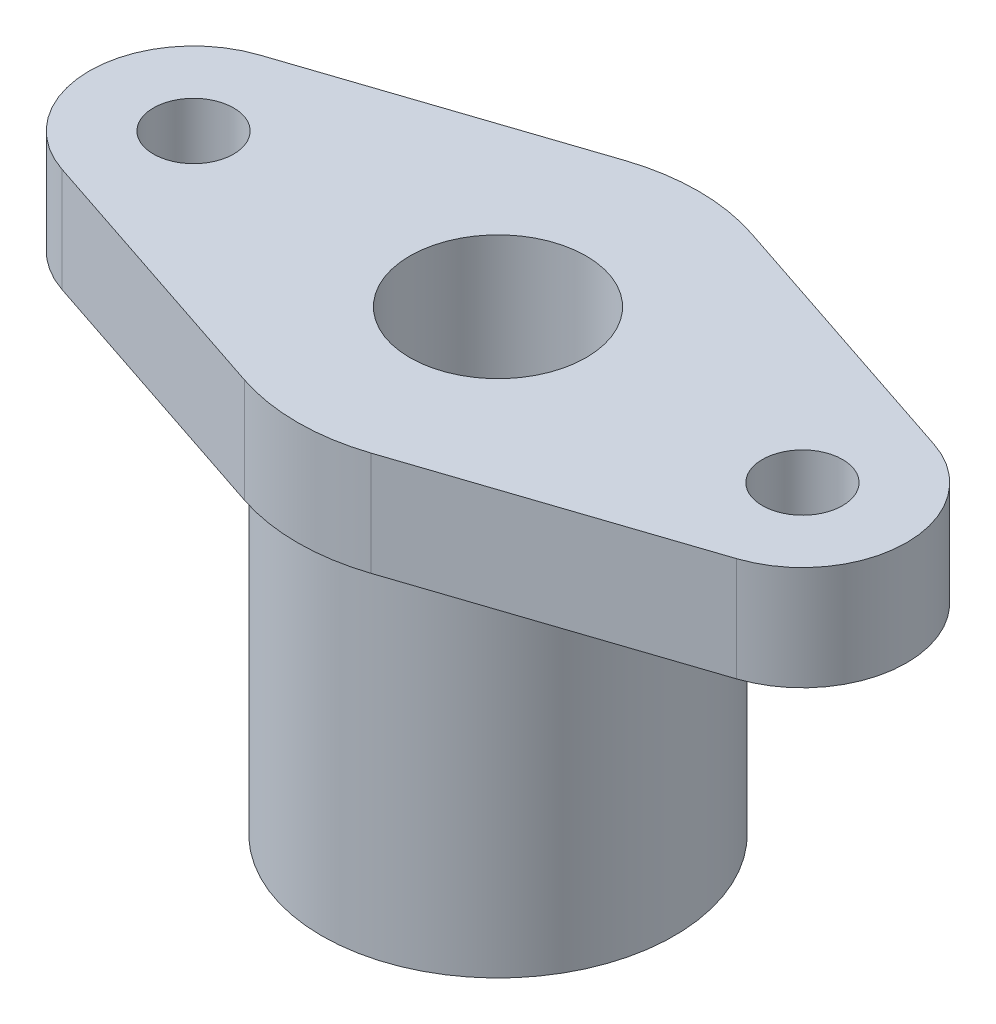
ISO-10303-21;
HEADER;
FILE_DESCRIPTION(('STEP AP214'),'2;1');
FILE_NAME('part.step','',(''),(''),'','','');
FILE_SCHEMA(('AUTOMOTIVE_DESIGN { 1 0 10303 214 1 1 1 1 }'));
ENDSEC;
DATA;
#1=APPLICATION_CONTEXT('core data for automotive mechanical design processes');
#2=APPLICATION_PROTOCOL_DEFINITION('international standard','automotive_design',2000,#1);
#3=PRODUCT_CONTEXT('',#1,'mechanical');
#4=PRODUCT('Part','Part','',(#3));
#5=PRODUCT_RELATED_PRODUCT_CATEGORY('part','',(#4));
#6=PRODUCT_DEFINITION_FORMATION('','',#4);
#7=PRODUCT_DEFINITION_CONTEXT('part definition',#1,'design');
#8=PRODUCT_DEFINITION('design','',#6,#7);
#9=PRODUCT_DEFINITION_SHAPE('','',#8);
#10=(LENGTH_UNIT() NAMED_UNIT(*) SI_UNIT(.MILLI.,.METRE.));
#11=(NAMED_UNIT(*) PLANE_ANGLE_UNIT() SI_UNIT($,.RADIAN.));
#12=(NAMED_UNIT(*) SI_UNIT($,.STERADIAN.) SOLID_ANGLE_UNIT());
#13=UNCERTAINTY_MEASURE_WITH_UNIT(LENGTH_MEASURE(1.E-05),#10,'distance_accuracy_value','');
#14=(GEOMETRIC_REPRESENTATION_CONTEXT(3) GLOBAL_UNCERTAINTY_ASSIGNED_CONTEXT((#13)) GLOBAL_UNIT_ASSIGNED_CONTEXT((#10,
#11,#12)) REPRESENTATION_CONTEXT('',''));
#15=CARTESIAN_POINT('',(0.,0.,0.));
#16=DIRECTION('',(0.,0.,1.));
#17=DIRECTION('',(1.,0.,0.));
#18=AXIS2_PLACEMENT_3D('',#15,#16,#17);
#19=CARTESIAN_POINT('',(0.,0.,0.));
#20=DIRECTION('',(0.,-1.,0.));
#21=DIRECTION('',(0.,0.,-1.));
#22=AXIS2_PLACEMENT_3D('',#19,#20,#21);
#23=CONICAL_SURFACE('',#22,22.,1.0471975511966);
#24=CARTESIAN_POINT('',(0.,6.35085296108579,0.));
#25=DIRECTION('',(0.,-1.,0.));
#26=DIRECTION('',(0.,0.,-1.));
#27=AXIS2_PLACEMENT_3D('',#24,#25,#26);
#28=CIRCLE('',#27,11.);
#29=CARTESIAN_POINT('',(0.,6.35085296108579,-11.));
#30=VERTEX_POINT('',#29);
#31=EDGE_CURVE('E43',#30,#30,#28,.T.);
#32=ORIENTED_EDGE('',*,*,#31,.F.);
#33=EDGE_LOOP('',(#32));
#34=FACE_BOUND('',#33,.T.);
#35=CARTESIAN_POINT('',(0.,0.,0.));
#36=DIRECTION('',(0.,-1.,0.));
#37=DIRECTION('',(0.,0.,-1.));
#38=AXIS2_PLACEMENT_3D('',#35,#36,#37);
#39=CIRCLE('',#38,22.);
#40=CARTESIAN_POINT('',(0.,0.,-22.));
#41=VERTEX_POINT('',#40);
#42=EDGE_CURVE('E11',#41,#41,#39,.T.);
#43=ORIENTED_EDGE('',*,*,#42,.T.);
#44=EDGE_LOOP('',(#43));
#45=FACE_BOUND('',#44,.T.);
#46=ADVANCED_FACE('F35',(#34,#45),#23,.F.);
#47=CARTESIAN_POINT('',(0.,0.,0.));
#48=DIRECTION('',(0.,-1.,0.));
#49=DIRECTION('',(0.,0.,-1.));
#50=AXIS2_PLACEMENT_3D('',#47,#48,#49);
#51=CYLINDRICAL_SURFACE('',#50,22.);
#52=ORIENTED_EDGE('',*,*,#42,.F.);
#53=EDGE_LOOP('',(#52));
#54=FACE_BOUND('',#53,.T.);
#55=CARTESIAN_POINT('',(0.,44.,0.));
#56=DIRECTION('',(0.,1.,0.));
#57=DIRECTION('',(0.,0.,1.));
#58=AXIS2_PLACEMENT_3D('',#55,#56,#57);
#59=CIRCLE('',#58,22.);
#60=CARTESIAN_POINT('',(0.,44.,22.));
#61=VERTEX_POINT('',#60);
#62=EDGE_CURVE('E170',#61,#61,#59,.T.);
#63=ORIENTED_EDGE('',*,*,#62,.F.);
#64=EDGE_LOOP('',(#63));
#65=FACE_BOUND('',#64,.T.);
#66=ADVANCED_FACE('F180',(#54,#65),#51,.T.);
#67=CARTESIAN_POINT('',(0.,0.,0.));
#68=DIRECTION('',(0.,-1.,0.));
#69=DIRECTION('',(0.,0.,-1.));
#70=AXIS2_PLACEMENT_3D('',#67,#68,#69);
#71=CYLINDRICAL_SURFACE('',#70,11.);
#72=ORIENTED_EDGE('',*,*,#31,.T.);
#73=EDGE_LOOP('',(#72));
#74=FACE_BOUND('',#73,.T.);
#75=CARTESIAN_POINT('',(0.,57.,0.));
#76=DIRECTION('',(0.,1.,0.));
#77=DIRECTION('',(0.,0.,1.));
#78=AXIS2_PLACEMENT_3D('',#75,#76,#77);
#79=CIRCLE('',#78,11.);
#80=CARTESIAN_POINT('',(0.,57.,11.));
#81=VERTEX_POINT('',#80);
#82=EDGE_CURVE('E157',#81,#81,#79,.F.);
#83=ORIENTED_EDGE('',*,*,#82,.F.);
#84=EDGE_LOOP('',(#83));
#85=FACE_BOUND('',#84,.T.);
#86=ADVANCED_FACE('F175',(#74,#85),#71,.F.);
#87=CARTESIAN_POINT('',(0.,44.,0.));
#88=DIRECTION('',(0.,1.,0.));
#89=DIRECTION('',(0.,0.,1.));
#90=AXIS2_PLACEMENT_3D('',#87,#88,#89);
#91=PLANE('',#90);
#92=DIRECTION('',(-0.948728755036644,0.,-0.316091362372685));
#93=VECTOR('',#92,1.);
#94=CARTESIAN_POINT('',(7.90591018677646,44.,-23.72910247414));
#95=LINE('',#94,#93);
#96=CARTESIAN_POINT('',(42.1091877108449,44.,-12.3334738154764));
#97=VERTEX_POINT('',#96);
#98=CARTESIAN_POINT('',(7.90591018677647,44.,-23.72910247414));
#99=VERTEX_POINT('',#98);
#100=EDGE_CURVE('E139',#97,#99,#95,.T.);
#101=ORIENTED_EDGE('',*,*,#100,.F.);
#102=CARTESIAN_POINT('',(38.,44.,0.));
#103=DIRECTION('',(0.,1.,0.));
#104=DIRECTION('',(0.,0.,1.));
#105=AXIS2_PLACEMENT_3D('',#102,#103,#104);
#106=CIRCLE('',#105,13.);
#107=CARTESIAN_POINT('',(42.1091877108449,44.,12.3334738154764));
#108=VERTEX_POINT('',#107);
#109=EDGE_CURVE('E154',#97,#108,#106,.F.);
#110=ORIENTED_EDGE('',*,*,#109,.T.);
#111=DIRECTION('',(-0.948728755036644,0.,0.316091362372685));
#112=VECTOR('',#111,1.);
#113=CARTESIAN_POINT('',(7.90591018677645,44.,23.72910247414));
#114=LINE('',#113,#112);
#115=CARTESIAN_POINT('',(7.90591018677647,44.,23.72910247414));
#116=VERTEX_POINT('',#115);
#117=EDGE_CURVE('E152',#108,#116,#114,.T.);
#118=ORIENTED_EDGE('',*,*,#117,.T.);
#119=CARTESIAN_POINT('',(0.,44.,0.));
#120=DIRECTION('',(0.,1.,0.));
#121=DIRECTION('',(0.,0.,1.));
#122=AXIS2_PLACEMENT_3D('',#119,#120,#121);
#123=CIRCLE('',#122,25.011471770162);
#124=CARTESIAN_POINT('',(-7.90591018677647,44.,23.72910247414));
#125=VERTEX_POINT('',#124);
#126=EDGE_CURVE('E122',#125,#116,#123,.T.);
#127=ORIENTED_EDGE('',*,*,#126,.F.);
#128=DIRECTION('',(0.948728755036644,0.,0.316091362372685));
#129=VECTOR('',#128,1.);
#130=CARTESIAN_POINT('',(-7.90591018677646,44.,23.72910247414));
#131=LINE('',#130,#129);
#132=CARTESIAN_POINT('',(-42.1091877108449,44.,12.3334738154764));
#133=VERTEX_POINT('',#132);
#134=EDGE_CURVE('E149',#133,#125,#131,.T.);
#135=ORIENTED_EDGE('',*,*,#134,.F.);
#136=CARTESIAN_POINT('',(-38.,44.,0.));
#137=DIRECTION('',(0.,1.,0.));
#138=DIRECTION('',(0.,0.,1.));
#139=AXIS2_PLACEMENT_3D('',#136,#137,#138);
#140=CIRCLE('',#139,13.);
#141=CARTESIAN_POINT('',(-42.1091877108449,44.,-12.3334738154764));
#142=VERTEX_POINT('',#141);
#143=EDGE_CURVE('E147',#142,#133,#140,.T.);
#144=ORIENTED_EDGE('',*,*,#143,.F.);
#145=DIRECTION('',(0.948728755036644,0.,-0.316091362372685));
#146=VECTOR('',#145,1.);
#147=CARTESIAN_POINT('',(-7.90591018677647,44.,-23.72910247414));
#148=LINE('',#147,#146);
#149=CARTESIAN_POINT('',(-7.90591018677647,44.,-23.72910247414));
#150=VERTEX_POINT('',#149);
#151=EDGE_CURVE('E144',#142,#150,#148,.T.);
#152=ORIENTED_EDGE('',*,*,#151,.T.);
#153=CARTESIAN_POINT('',(0.,44.,0.));
#154=DIRECTION('',(0.,1.,0.));
#155=DIRECTION('',(0.,0.,1.));
#156=AXIS2_PLACEMENT_3D('',#153,#154,#155);
#157=CIRCLE('',#156,25.011471770162);
#158=EDGE_CURVE('E141',#99,#150,#157,.T.);
#159=ORIENTED_EDGE('',*,*,#158,.F.);
#160=EDGE_LOOP('',(#101,#110,#118,#127,#135,#144,#152,#159));
#161=FACE_BOUND('',#160,.T.);
#162=CARTESIAN_POINT('',(-38.,44.,0.));
#163=DIRECTION('',(0.,1.,0.));
#164=DIRECTION('',(0.,0.,1.));
#165=AXIS2_PLACEMENT_3D('',#162,#163,#164);
#166=CIRCLE('',#165,5.);
#167=CARTESIAN_POINT('',(-38.,44.,-5.));
#168=VERTEX_POINT('',#167);
#169=EDGE_CURVE('E136',#168,#168,#166,.T.);
#170=ORIENTED_EDGE('',*,*,#169,.T.);
#171=EDGE_LOOP('',(#170));
#172=FACE_BOUND('',#171,.T.);
#173=CARTESIAN_POINT('',(38.,44.,0.));
#174=DIRECTION('',(0.,1.,0.));
#175=DIRECTION('',(0.,0.,1.));
#176=AXIS2_PLACEMENT_3D('',#173,#174,#175);
#177=CIRCLE('',#176,5.);
#178=CARTESIAN_POINT('',(38.,44.,-5.));
#179=VERTEX_POINT('',#178);
#180=EDGE_CURVE('E133',#179,#179,#177,.F.);
#181=ORIENTED_EDGE('',*,*,#180,.F.);
#182=EDGE_LOOP('',(#181));
#183=FACE_BOUND('',#182,.T.);
#184=ORIENTED_EDGE('',*,*,#62,.T.);
#185=EDGE_LOOP('',(#184));
#186=FACE_BOUND('',#185,.T.);
#187=ADVANCED_FACE('F187',(#161,#172,#183,#186),#91,.F.);
#188=CARTESIAN_POINT('',(7.90591018677646,57.,-23.72910247414));
#189=DIRECTION('',(-0.316091362372685,0.,0.948728755036644));
#190=DIRECTION('',(0.948728755036644,0.,0.316091362372685));
#191=AXIS2_PLACEMENT_3D('',#188,#189,#190);
#192=PLANE('',#191);
#193=ORIENTED_EDGE('',*,*,#100,.T.);
#194=DIRECTION('',(0.,-1.,0.));
#195=VECTOR('',#194,1.);
#196=CARTESIAN_POINT('',(7.90591018677647,57.,-23.72910247414));
#197=LINE('',#196,#195);
#198=CARTESIAN_POINT('',(7.90591018677647,57.,-23.72910247414));
#199=VERTEX_POINT('',#198);
#200=EDGE_CURVE('E168',#199,#99,#197,.T.);
#201=ORIENTED_EDGE('',*,*,#200,.F.);
#202=DIRECTION('',(-0.948728755036644,0.,-0.316091362372685));
#203=VECTOR('',#202,1.);
#204=CARTESIAN_POINT('',(7.90591018677646,57.,-23.72910247414));
#205=LINE('',#204,#203);
#206=CARTESIAN_POINT('',(42.1091877108449,57.,-12.3334738154764));
#207=VERTEX_POINT('',#206);
#208=EDGE_CURVE('E242',#207,#199,#205,.T.);
#209=ORIENTED_EDGE('',*,*,#208,.F.);
#210=DIRECTION('',(0.,-1.,0.));
#211=VECTOR('',#210,1.);
#212=CARTESIAN_POINT('',(42.1091877108449,57.,-12.3334738154764));
#213=LINE('',#212,#211);
#214=EDGE_CURVE('E51',#207,#97,#213,.T.);
#215=ORIENTED_EDGE('',*,*,#214,.T.);
#216=EDGE_LOOP('',(#193,#201,#209,#215));
#217=FACE_BOUND('',#216,.T.);
#218=ADVANCED_FACE('F189',(#217),#192,.F.);
#219=CARTESIAN_POINT('',(0.,57.,0.));
#220=DIRECTION('',(0.,-1.,0.));
#221=DIRECTION('',(0.,0.,-1.));
#222=AXIS2_PLACEMENT_3D('',#219,#220,#221);
#223=CYLINDRICAL_SURFACE('',#222,25.011471770162);
#224=ORIENTED_EDGE('',*,*,#158,.T.);
#225=DIRECTION('',(0.,-1.,0.));
#226=VECTOR('',#225,1.);
#227=CARTESIAN_POINT('',(-7.90591018677647,57.,-23.72910247414));
#228=LINE('',#227,#226);
#229=CARTESIAN_POINT('',(-7.90591018677647,57.,-23.72910247414));
#230=VERTEX_POINT('',#229);
#231=EDGE_CURVE('E166',#230,#150,#228,.T.);
#232=ORIENTED_EDGE('',*,*,#231,.F.);
#233=CARTESIAN_POINT('',(0.,57.,0.));
#234=DIRECTION('',(0.,1.,0.));
#235=DIRECTION('',(0.,0.,1.));
#236=AXIS2_PLACEMENT_3D('',#233,#234,#235);
#237=CIRCLE('',#236,25.011471770162);
#238=EDGE_CURVE('E90',#199,#230,#237,.T.);
#239=ORIENTED_EDGE('',*,*,#238,.F.);
#240=ORIENTED_EDGE('',*,*,#200,.T.);
#241=EDGE_LOOP('',(#224,#232,#239,#240));
#242=FACE_BOUND('',#241,.T.);
#243=ADVANCED_FACE('F196',(#242),#223,.T.);
#244=CARTESIAN_POINT('',(-7.90591018677647,57.,-23.72910247414));
#245=DIRECTION('',(-0.316091362372685,0.,-0.948728755036644));
#246=DIRECTION('',(-0.948728755036644,0.,0.316091362372685));
#247=AXIS2_PLACEMENT_3D('',#244,#245,#246);
#248=PLANE('',#247);
#249=ORIENTED_EDGE('',*,*,#151,.F.);
#250=DIRECTION('',(0.,-1.,0.));
#251=VECTOR('',#250,1.);
#252=CARTESIAN_POINT('',(-42.1091877108449,57.,-12.3334738154764));
#253=LINE('',#252,#251);
#254=CARTESIAN_POINT('',(-42.1091877108449,57.,-12.3334738154764));
#255=VERTEX_POINT('',#254);
#256=EDGE_CURVE('E164',#255,#142,#253,.T.);
#257=ORIENTED_EDGE('',*,*,#256,.F.);
#258=DIRECTION('',(0.948728755036644,0.,-0.316091362372685));
#259=VECTOR('',#258,1.);
#260=CARTESIAN_POINT('',(-7.90591018677647,57.,-23.72910247414));
#261=LINE('',#260,#259);
#262=EDGE_CURVE('E249',#255,#230,#261,.T.);
#263=ORIENTED_EDGE('',*,*,#262,.T.);
#264=ORIENTED_EDGE('',*,*,#231,.T.);
#265=EDGE_LOOP('',(#249,#257,#263,#264));
#266=FACE_BOUND('',#265,.T.);
#267=ADVANCED_FACE('F218',(#266),#248,.T.);
#268=CARTESIAN_POINT('',(-38.,57.,0.));
#269=DIRECTION('',(0.,-1.,0.));
#270=DIRECTION('',(0.,0.,-1.));
#271=AXIS2_PLACEMENT_3D('',#268,#269,#270);
#272=CYLINDRICAL_SURFACE('',#271,13.);
#273=ORIENTED_EDGE('',*,*,#143,.T.);
#274=DIRECTION('',(0.,-1.,0.));
#275=VECTOR('',#274,1.);
#276=CARTESIAN_POINT('',(-42.1091877108449,57.,12.3334738154764));
#277=LINE('',#276,#275);
#278=CARTESIAN_POINT('',(-42.1091877108449,57.,12.3334738154764));
#279=VERTEX_POINT('',#278);
#280=EDGE_CURVE('E161',#279,#133,#277,.T.);
#281=ORIENTED_EDGE('',*,*,#280,.F.);
#282=CARTESIAN_POINT('',(-38.,57.,0.));
#283=DIRECTION('',(0.,1.,0.));
#284=DIRECTION('',(0.,0.,1.));
#285=AXIS2_PLACEMENT_3D('',#282,#283,#284);
#286=CIRCLE('',#285,13.);
#287=EDGE_CURVE('E252',#255,#279,#286,.T.);
#288=ORIENTED_EDGE('',*,*,#287,.F.);
#289=ORIENTED_EDGE('',*,*,#256,.T.);
#290=EDGE_LOOP('',(#273,#281,#288,#289));
#291=FACE_BOUND('',#290,.T.);
#292=ADVANCED_FACE('F214',(#291),#272,.T.);
#293=CARTESIAN_POINT('',(-7.90591018677646,57.,23.72910247414));
#294=DIRECTION('',(0.316091362372685,0.,-0.948728755036644));
#295=DIRECTION('',(-0.948728755036644,0.,-0.316091362372685));
#296=AXIS2_PLACEMENT_3D('',#293,#294,#295);
#297=PLANE('',#296);
#298=ORIENTED_EDGE('',*,*,#134,.T.);
#299=DIRECTION('',(0.,-1.,0.));
#300=VECTOR('',#299,1.);
#301=CARTESIAN_POINT('',(-7.90591018677647,57.,23.72910247414));
#302=LINE('',#301,#300);
#303=CARTESIAN_POINT('',(-7.90591018677647,57.,23.72910247414));
#304=VERTEX_POINT('',#303);
#305=EDGE_CURVE('E125',#304,#125,#302,.T.);
#306=ORIENTED_EDGE('',*,*,#305,.F.);
#307=DIRECTION('',(0.948728755036644,0.,0.316091362372685));
#308=VECTOR('',#307,1.);
#309=CARTESIAN_POINT('',(-7.90591018677646,57.,23.72910247414));
#310=LINE('',#309,#308);
#311=EDGE_CURVE('E113',#279,#304,#310,.T.);
#312=ORIENTED_EDGE('',*,*,#311,.F.);
#313=ORIENTED_EDGE('',*,*,#280,.T.);
#314=EDGE_LOOP('',(#298,#306,#312,#313));
#315=FACE_BOUND('',#314,.T.);
#316=ADVANCED_FACE('F211',(#315),#297,.F.);
#317=CARTESIAN_POINT('',(0.,57.,0.));
#318=DIRECTION('',(0.,-1.,0.));
#319=DIRECTION('',(0.,0.,-1.));
#320=AXIS2_PLACEMENT_3D('',#317,#318,#319);
#321=CYLINDRICAL_SURFACE('',#320,25.011471770162);
#322=ORIENTED_EDGE('',*,*,#126,.T.);
#323=DIRECTION('',(0.,-1.,0.));
#324=VECTOR('',#323,1.);
#325=CARTESIAN_POINT('',(7.90591018677647,57.,23.72910247414));
#326=LINE('',#325,#324);
#327=CARTESIAN_POINT('',(7.90591018677647,57.,23.72910247414));
#328=VERTEX_POINT('',#327);
#329=EDGE_CURVE('E119',#328,#116,#326,.T.);
#330=ORIENTED_EDGE('',*,*,#329,.F.);
#331=CARTESIAN_POINT('',(0.,57.,0.));
#332=DIRECTION('',(0.,1.,0.));
#333=DIRECTION('',(0.,0.,1.));
#334=AXIS2_PLACEMENT_3D('',#331,#332,#333);
#335=CIRCLE('',#334,25.011471770162);
#336=EDGE_CURVE('E106',#304,#328,#335,.T.);
#337=ORIENTED_EDGE('',*,*,#336,.F.);
#338=ORIENTED_EDGE('',*,*,#305,.T.);
#339=EDGE_LOOP('',(#322,#330,#337,#338));
#340=FACE_BOUND('',#339,.T.);
#341=ADVANCED_FACE('F120',(#340),#321,.T.);
#342=CARTESIAN_POINT('',(7.90591018677645,57.,23.72910247414));
#343=DIRECTION('',(0.316091362372685,0.,0.948728755036644));
#344=DIRECTION('',(0.948728755036644,0.,-0.316091362372685));
#345=AXIS2_PLACEMENT_3D('',#342,#343,#344);
#346=PLANE('',#345);
#347=ORIENTED_EDGE('',*,*,#117,.F.);
#348=DIRECTION('',(0.,-1.,0.));
#349=VECTOR('',#348,1.);
#350=CARTESIAN_POINT('',(42.1091877108449,57.,12.3334738154764));
#351=LINE('',#350,#349);
#352=CARTESIAN_POINT('',(42.1091877108449,57.,12.3334738154764));
#353=VERTEX_POINT('',#352);
#354=EDGE_CURVE('E77',#353,#108,#351,.T.);
#355=ORIENTED_EDGE('',*,*,#354,.F.);
#356=DIRECTION('',(-0.948728755036644,0.,0.316091362372685));
#357=VECTOR('',#356,1.);
#358=CARTESIAN_POINT('',(7.90591018677645,57.,23.72910247414));
#359=LINE('',#358,#357);
#360=EDGE_CURVE('E111',#353,#328,#359,.T.);
#361=ORIENTED_EDGE('',*,*,#360,.T.);
#362=ORIENTED_EDGE('',*,*,#329,.T.);
#363=EDGE_LOOP('',(#347,#355,#361,#362));
#364=FACE_BOUND('',#363,.T.);
#365=ADVANCED_FACE('F127',(#364),#346,.T.);
#366=CARTESIAN_POINT('',(-38.,57.,0.));
#367=DIRECTION('',(0.,-1.,0.));
#368=DIRECTION('',(0.,0.,-1.));
#369=AXIS2_PLACEMENT_3D('',#366,#367,#368);
#370=CYLINDRICAL_SURFACE('',#369,5.);
#371=CARTESIAN_POINT('',(-38.,57.,0.));
#372=DIRECTION('',(0.,1.,0.));
#373=DIRECTION('',(0.,0.,1.));
#374=AXIS2_PLACEMENT_3D('',#371,#372,#373);
#375=CIRCLE('',#374,5.);
#376=CARTESIAN_POINT('',(-38.,57.,-5.));
#377=VERTEX_POINT('',#376);
#378=EDGE_CURVE('E239',#377,#377,#375,.T.);
#379=CARTESIAN_POINT('',(-38.,57.,-5.));
#380=CARTESIAN_POINT('',(-38.,56.8645833333333,-5.));
#381=CARTESIAN_POINT('',(-38.,56.7291666666667,-5.));
#382=CARTESIAN_POINT('',(-38.,56.4583333333333,-5.));
#383=CARTESIAN_POINT('',(-38.,56.3229166666667,-5.));
#384=CARTESIAN_POINT('',(-38.,56.0520833333333,-5.));
#385=CARTESIAN_POINT('',(-38.,55.9166666666667,-5.));
#386=CARTESIAN_POINT('',(-38.,55.6458333333333,-5.));
#387=CARTESIAN_POINT('',(-38.,55.5104166666667,-5.));
#388=CARTESIAN_POINT('',(-38.,55.2395833333333,-5.));
#389=CARTESIAN_POINT('',(-38.,55.1041666666667,-5.));
#390=CARTESIAN_POINT('',(-38.,54.8333333333333,-5.));
#391=CARTESIAN_POINT('',(-38.,54.6979166666667,-5.));
#392=CARTESIAN_POINT('',(-38.,54.4270833333333,-5.));
#393=CARTESIAN_POINT('',(-38.,54.2916666666667,-5.));
#394=CARTESIAN_POINT('',(-38.,54.0208333333333,-5.));
#395=CARTESIAN_POINT('',(-38.,53.8854166666667,-5.));
#396=CARTESIAN_POINT('',(-38.,53.6145833333333,-5.));
#397=CARTESIAN_POINT('',(-38.,53.4791666666667,-5.));
#398=CARTESIAN_POINT('',(-38.,53.2083333333333,-5.));
#399=CARTESIAN_POINT('',(-38.,53.0729166666667,-5.));
#400=CARTESIAN_POINT('',(-38.,52.8020833333333,-5.));
#401=CARTESIAN_POINT('',(-38.,52.6666666666667,-5.));
#402=CARTESIAN_POINT('',(-38.,52.3958333333333,-5.));
#403=CARTESIAN_POINT('',(-38.,52.2604166666667,-5.));
#404=CARTESIAN_POINT('',(-38.,51.9895833333333,-5.));
#405=CARTESIAN_POINT('',(-38.,51.8541666666667,-5.));
#406=CARTESIAN_POINT('',(-38.,51.5833333333333,-5.));
#407=CARTESIAN_POINT('',(-38.,51.4479166666667,-5.));
#408=CARTESIAN_POINT('',(-38.,51.1770833333333,-5.));
#409=CARTESIAN_POINT('',(-38.,51.0416666666667,-5.));
#410=CARTESIAN_POINT('',(-38.,50.7708333333333,-5.));
#411=CARTESIAN_POINT('',(-38.,50.6354166666667,-5.));
#412=CARTESIAN_POINT('',(-38.,50.3645833333333,-5.));
#413=CARTESIAN_POINT('',(-38.,50.2291666666667,-5.));
#414=CARTESIAN_POINT('',(-38.,49.9583333333333,-5.));
#415=CARTESIAN_POINT('',(-38.,49.8229166666667,-5.));
#416=CARTESIAN_POINT('',(-38.,49.5520833333333,-5.));
#417=CARTESIAN_POINT('',(-38.,49.4166666666667,-5.));
#418=CARTESIAN_POINT('',(-38.,49.1458333333333,-5.));
#419=CARTESIAN_POINT('',(-38.,49.0104166666667,-5.));
#420=CARTESIAN_POINT('',(-38.,48.7395833333333,-5.));
#421=CARTESIAN_POINT('',(-38.,48.6041666666667,-5.));
#422=CARTESIAN_POINT('',(-38.,48.3333333333333,-5.));
#423=CARTESIAN_POINT('',(-38.,48.1979166666667,-5.));
#424=CARTESIAN_POINT('',(-38.,47.9270833333333,-5.));
#425=CARTESIAN_POINT('',(-38.,47.7916666666667,-5.));
#426=CARTESIAN_POINT('',(-38.,47.5208333333333,-5.));
#427=CARTESIAN_POINT('',(-38.,47.3854166666667,-5.));
#428=CARTESIAN_POINT('',(-38.,47.1145833333333,-5.));
#429=CARTESIAN_POINT('',(-38.,46.9791666666667,-5.));
#430=CARTESIAN_POINT('',(-38.,46.7083333333333,-5.));
#431=CARTESIAN_POINT('',(-38.,46.5729166666667,-5.));
#432=CARTESIAN_POINT('',(-38.,46.3020833333333,-5.));
#433=CARTESIAN_POINT('',(-38.,46.1666666666667,-5.));
#434=CARTESIAN_POINT('',(-38.,45.8958333333333,-5.));
#435=CARTESIAN_POINT('',(-38.,45.7604166666667,-5.));
#436=CARTESIAN_POINT('',(-38.,45.4895833333333,-5.));
#437=CARTESIAN_POINT('',(-38.,45.3541666666667,-5.));
#438=CARTESIAN_POINT('',(-38.,45.0833333333333,-5.));
#439=CARTESIAN_POINT('',(-38.,44.9479166666667,-5.));
#440=CARTESIAN_POINT('',(-38.,44.6770833333333,-5.));
#441=CARTESIAN_POINT('',(-38.,44.5416666666667,-5.));
#442=CARTESIAN_POINT('',(-38.,44.2708333333333,-5.));
#443=CARTESIAN_POINT('',(-38.,44.1354166666667,-5.));
#444=CARTESIAN_POINT('',(-38.,44.,-5.));
#445=B_SPLINE_CURVE_WITH_KNOTS('',3,(#379,#380,#381,#382,#383,#384,#385,#386,#387,#388,#389,
#390,#391,#392,#393,#394,#395,#396,#397,#398,#399,#400,#401,#402,#403,#404,#405,#406,#407,#408,
#409,#410,#411,#412,#413,#414,#415,#416,#417,#418,#419,#420,#421,#422,#423,#424,#425,#426,#427,
#428,#429,#430,#431,#432,#433,#434,#435,#436,#437,#438,#439,#440,#441,#442,#443,#444),
.UNSPECIFIED.,.F.,.F.,(4,2,2,2,2,2,2,2,2,2,2,2,2,2,2,2,2,2,2,2,2,2,2,2,2,2,2,2,2,2,2,2,4),(0.,
0.406249999999997,0.812499999999994,1.21875,1.62499999999999,2.03125,2.4375,2.84375,3.25,
3.65624999999999,4.0625,4.46874999999999,4.875,5.28124999999999,5.6875,6.09374999999999,6.5,
6.90625,7.31249999999999,7.71875,8.12499999999999,8.53125,8.93749999999999,9.34375,
9.74999999999999,10.15625,10.5625,10.96875,11.375,11.78125,12.1875,12.59375,13.),.UNSPECIFIED.);
#446=EDGE_CURVE('BSEAM208',#377,#168,#445,.T.);
#447=ORIENTED_EDGE('',*,*,#378,.T.);
#448=ORIENTED_EDGE('',*,*,#169,.F.);
#449=ORIENTED_EDGE('',*,*,#446,.T.);
#450=ORIENTED_EDGE('',*,*,#446,.F.);
#451=EDGE_LOOP('',(#447,#449,#448,#450));
#452=FACE_BOUND('',#451,.T.);
#453=ADVANCED_FACE('F208',(#452),#370,.F.);
#454=CARTESIAN_POINT('',(38.,57.,0.));
#455=DIRECTION('',(0.,-1.,0.));
#456=DIRECTION('',(0.,0.,-1.));
#457=AXIS2_PLACEMENT_3D('',#454,#455,#456);
#458=CYLINDRICAL_SURFACE('',#457,5.);
#459=CARTESIAN_POINT('',(38.,57.,0.));
#460=DIRECTION('',(0.,1.,0.));
#461=DIRECTION('',(0.,0.,1.));
#462=AXIS2_PLACEMENT_3D('',#459,#460,#461);
#463=CIRCLE('',#462,5.);
#464=CARTESIAN_POINT('',(38.,57.,-5.));
#465=VERTEX_POINT('',#464);
#466=EDGE_CURVE('E235',#465,#465,#463,.F.);
#467=CARTESIAN_POINT('',(38.,57.,-5.));
#468=CARTESIAN_POINT('',(38.,56.8645833333333,-5.));
#469=CARTESIAN_POINT('',(38.,56.7291666666667,-5.));
#470=CARTESIAN_POINT('',(38.,56.4583333333333,-5.));
#471=CARTESIAN_POINT('',(38.,56.3229166666667,-5.));
#472=CARTESIAN_POINT('',(38.,56.0520833333333,-5.));
#473=CARTESIAN_POINT('',(38.,55.9166666666667,-5.));
#474=CARTESIAN_POINT('',(38.,55.6458333333333,-5.));
#475=CARTESIAN_POINT('',(38.,55.5104166666667,-5.));
#476=CARTESIAN_POINT('',(38.,55.2395833333333,-5.));
#477=CARTESIAN_POINT('',(38.,55.1041666666667,-5.));
#478=CARTESIAN_POINT('',(38.,54.8333333333333,-5.));
#479=CARTESIAN_POINT('',(38.,54.6979166666667,-5.));
#480=CARTESIAN_POINT('',(38.,54.4270833333333,-5.));
#481=CARTESIAN_POINT('',(38.,54.2916666666667,-5.));
#482=CARTESIAN_POINT('',(38.,54.0208333333333,-5.));
#483=CARTESIAN_POINT('',(38.,53.8854166666667,-5.));
#484=CARTESIAN_POINT('',(38.,53.6145833333333,-5.));
#485=CARTESIAN_POINT('',(38.,53.4791666666667,-5.));
#486=CARTESIAN_POINT('',(38.,53.2083333333333,-5.));
#487=CARTESIAN_POINT('',(38.,53.0729166666667,-5.));
#488=CARTESIAN_POINT('',(38.,52.8020833333333,-5.));
#489=CARTESIAN_POINT('',(38.,52.6666666666667,-5.));
#490=CARTESIAN_POINT('',(38.,52.3958333333333,-5.));
#491=CARTESIAN_POINT('',(38.,52.2604166666667,-5.));
#492=CARTESIAN_POINT('',(38.,51.9895833333333,-5.));
#493=CARTESIAN_POINT('',(38.,51.8541666666667,-5.));
#494=CARTESIAN_POINT('',(38.,51.5833333333333,-5.));
#495=CARTESIAN_POINT('',(38.,51.4479166666667,-5.));
#496=CARTESIAN_POINT('',(38.,51.1770833333333,-5.));
#497=CARTESIAN_POINT('',(38.,51.0416666666667,-5.));
#498=CARTESIAN_POINT('',(38.,50.7708333333333,-5.));
#499=CARTESIAN_POINT('',(38.,50.6354166666667,-5.));
#500=CARTESIAN_POINT('',(38.,50.3645833333333,-5.));
#501=CARTESIAN_POINT('',(38.,50.2291666666667,-5.));
#502=CARTESIAN_POINT('',(38.,49.9583333333333,-5.));
#503=CARTESIAN_POINT('',(38.,49.8229166666667,-5.));
#504=CARTESIAN_POINT('',(38.,49.5520833333333,-5.));
#505=CARTESIAN_POINT('',(38.,49.4166666666667,-5.));
#506=CARTESIAN_POINT('',(38.,49.1458333333333,-5.));
#507=CARTESIAN_POINT('',(38.,49.0104166666667,-5.));
#508=CARTESIAN_POINT('',(38.,48.7395833333333,-5.));
#509=CARTESIAN_POINT('',(38.,48.6041666666667,-5.));
#510=CARTESIAN_POINT('',(38.,48.3333333333333,-5.));
#511=CARTESIAN_POINT('',(38.,48.1979166666667,-5.));
#512=CARTESIAN_POINT('',(38.,47.9270833333333,-5.));
#513=CARTESIAN_POINT('',(38.,47.7916666666667,-5.));
#514=CARTESIAN_POINT('',(38.,47.5208333333333,-5.));
#515=CARTESIAN_POINT('',(38.,47.3854166666667,-5.));
#516=CARTESIAN_POINT('',(38.,47.1145833333333,-5.));
#517=CARTESIAN_POINT('',(38.,46.9791666666667,-5.));
#518=CARTESIAN_POINT('',(38.,46.7083333333333,-5.));
#519=CARTESIAN_POINT('',(38.,46.5729166666667,-5.));
#520=CARTESIAN_POINT('',(38.,46.3020833333333,-5.));
#521=CARTESIAN_POINT('',(38.,46.1666666666667,-5.));
#522=CARTESIAN_POINT('',(38.,45.8958333333333,-5.));
#523=CARTESIAN_POINT('',(38.,45.7604166666667,-5.));
#524=CARTESIAN_POINT('',(38.,45.4895833333333,-5.));
#525=CARTESIAN_POINT('',(38.,45.3541666666667,-5.));
#526=CARTESIAN_POINT('',(38.,45.0833333333333,-5.));
#527=CARTESIAN_POINT('',(38.,44.9479166666667,-5.));
#528=CARTESIAN_POINT('',(38.,44.6770833333333,-5.));
#529=CARTESIAN_POINT('',(38.,44.5416666666667,-5.));
#530=CARTESIAN_POINT('',(38.,44.2708333333333,-5.));
#531=CARTESIAN_POINT('',(38.,44.1354166666667,-5.));
#532=CARTESIAN_POINT('',(38.,44.,-5.));
#533=B_SPLINE_CURVE_WITH_KNOTS('',3,(#467,#468,#469,#470,#471,#472,#473,#474,#475,#476,#477,
#478,#479,#480,#481,#482,#483,#484,#485,#486,#487,#488,#489,#490,#491,#492,#493,#494,#495,#496,
#497,#498,#499,#500,#501,#502,#503,#504,#505,#506,#507,#508,#509,#510,#511,#512,#513,#514,#515,
#516,#517,#518,#519,#520,#521,#522,#523,#524,#525,#526,#527,#528,#529,#530,#531,#532),
.UNSPECIFIED.,.F.,.F.,(4,2,2,2,2,2,2,2,2,2,2,2,2,2,2,2,2,2,2,2,2,2,2,2,2,2,2,2,2,2,2,2,4),(0.,
0.406249999999997,0.812499999999994,1.21875,1.62499999999999,2.03125,2.4375,2.84375,3.25,
3.65624999999999,4.0625,4.46874999999999,4.875,5.28124999999999,5.6875,6.09374999999999,6.5,
6.90625,7.31249999999999,7.71875,8.12499999999999,8.53125,8.93749999999999,9.34375,
9.74999999999999,10.15625,10.5625,10.96875,11.375,11.78125,12.1875,12.59375,13.),.UNSPECIFIED.);
#534=EDGE_CURVE('BSEAM205',#465,#179,#533,.T.);
#535=ORIENTED_EDGE('',*,*,#466,.F.);
#536=ORIENTED_EDGE('',*,*,#180,.T.);
#537=ORIENTED_EDGE('',*,*,#534,.T.);
#538=ORIENTED_EDGE('',*,*,#534,.F.);
#539=EDGE_LOOP('',(#535,#537,#536,#538));
#540=FACE_BOUND('',#539,.T.);
#541=ADVANCED_FACE('F205',(#540),#458,.F.);
#542=CARTESIAN_POINT('',(38.,57.,0.));
#543=DIRECTION('',(0.,-1.,0.));
#544=DIRECTION('',(0.,0.,-1.));
#545=AXIS2_PLACEMENT_3D('',#542,#543,#544);
#546=CYLINDRICAL_SURFACE('',#545,13.);
#547=ORIENTED_EDGE('',*,*,#109,.F.);
#548=ORIENTED_EDGE('',*,*,#214,.F.);
#549=CARTESIAN_POINT('',(38.,57.,0.));
#550=DIRECTION('',(0.,1.,0.));
#551=DIRECTION('',(0.,0.,1.));
#552=AXIS2_PLACEMENT_3D('',#549,#550,#551);
#553=CIRCLE('',#552,13.);
#554=EDGE_CURVE('E128',#207,#353,#553,.F.);
#555=ORIENTED_EDGE('',*,*,#554,.T.);
#556=ORIENTED_EDGE('',*,*,#354,.T.);
#557=EDGE_LOOP('',(#547,#548,#555,#556));
#558=FACE_BOUND('',#557,.T.);
#559=ADVANCED_FACE('F202',(#558),#546,.T.);
#560=CARTESIAN_POINT('',(0.,57.,0.));
#561=DIRECTION('',(0.,1.,0.));
#562=DIRECTION('',(0.,0.,1.));
#563=AXIS2_PLACEMENT_3D('',#560,#561,#562);
#564=PLANE('',#563);
#565=ORIENTED_EDGE('',*,*,#82,.T.);
#566=EDGE_LOOP('',(#565));
#567=FACE_BOUND('',#566,.T.);
#568=ORIENTED_EDGE('',*,*,#466,.T.);
#569=EDGE_LOOP('',(#568));
#570=FACE_BOUND('',#569,.T.);
#571=ORIENTED_EDGE('',*,*,#378,.F.);
#572=EDGE_LOOP('',(#571));
#573=FACE_BOUND('',#572,.T.);
#574=ORIENTED_EDGE('',*,*,#208,.T.);
#575=ORIENTED_EDGE('',*,*,#238,.T.);
#576=ORIENTED_EDGE('',*,*,#262,.F.);
#577=ORIENTED_EDGE('',*,*,#287,.T.);
#578=ORIENTED_EDGE('',*,*,#311,.T.);
#579=ORIENTED_EDGE('',*,*,#336,.T.);
#580=ORIENTED_EDGE('',*,*,#360,.F.);
#581=ORIENTED_EDGE('',*,*,#554,.F.);
#582=EDGE_LOOP('',(#574,#575,#576,#577,#578,#579,#580,#581));
#583=FACE_BOUND('',#582,.T.);
#584=ADVANCED_FACE('F108',(#567,#570,#573,#583),#564,.T.);
#585=CLOSED_SHELL('',(#46,#66,#86,#187,#218,#243,#267,#292,#316,#341,#365,#453,#541,#559,#584));
#586=MANIFOLD_SOLID_BREP('B2',#585);
#587=ADVANCED_BREP_SHAPE_REPRESENTATION('',(#18,#586),#14);
#588=SHAPE_DEFINITION_REPRESENTATION(#9,#587);
ENDSEC;
END-ISO-10303-21;
